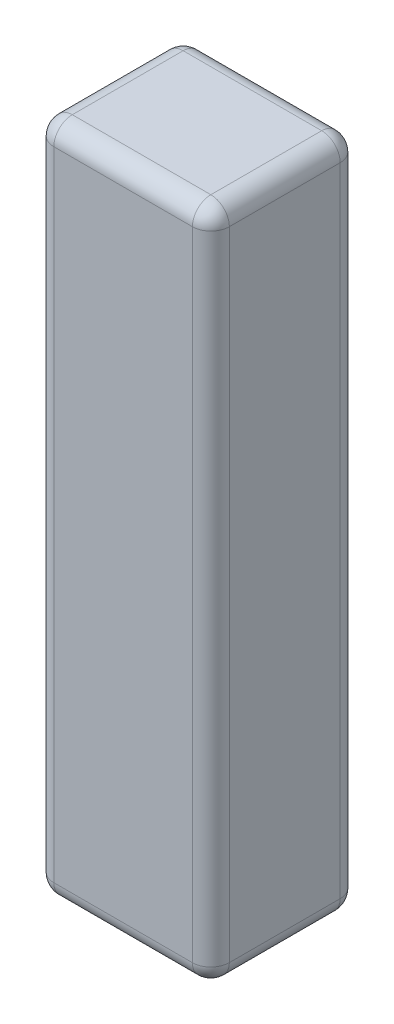
ISO-10303-21;
HEADER;
FILE_DESCRIPTION(('STEP AP214'),'2;1');
FILE_NAME('part.step','',(''),(''),'','','');
FILE_SCHEMA(('AUTOMOTIVE_DESIGN { 1 0 10303 214 1 1 1 1 }'));
ENDSEC;
DATA;
#1=APPLICATION_CONTEXT('core data for automotive mechanical design processes');
#2=APPLICATION_PROTOCOL_DEFINITION('international standard','automotive_design',2000,#1);
#3=PRODUCT_CONTEXT('',#1,'mechanical');
#4=PRODUCT('Part','Part','',(#3));
#5=PRODUCT_RELATED_PRODUCT_CATEGORY('part','',(#4));
#6=PRODUCT_DEFINITION_FORMATION('','',#4);
#7=PRODUCT_DEFINITION_CONTEXT('part definition',#1,'design');
#8=PRODUCT_DEFINITION('design','',#6,#7);
#9=PRODUCT_DEFINITION_SHAPE('','',#8);
#10=(LENGTH_UNIT() NAMED_UNIT(*) SI_UNIT(.MILLI.,.METRE.));
#11=(NAMED_UNIT(*) PLANE_ANGLE_UNIT() SI_UNIT($,.RADIAN.));
#12=(NAMED_UNIT(*) SI_UNIT($,.STERADIAN.) SOLID_ANGLE_UNIT());
#13=UNCERTAINTY_MEASURE_WITH_UNIT(LENGTH_MEASURE(1.E-05),#10,'distance_accuracy_value','');
#14=(GEOMETRIC_REPRESENTATION_CONTEXT(3) GLOBAL_UNCERTAINTY_ASSIGNED_CONTEXT((#13)) GLOBAL_UNIT_ASSIGNED_CONTEXT((#10,
#11,#12)) REPRESENTATION_CONTEXT('',''));
#15=CARTESIAN_POINT('',(0.,0.,0.));
#16=DIRECTION('',(0.,0.,1.));
#17=DIRECTION('',(1.,0.,0.));
#18=AXIS2_PLACEMENT_3D('',#15,#16,#17);
#19=CARTESIAN_POINT('',(9.5,73.,8.));
#20=DIRECTION('',(-1.,0.,0.));
#21=DIRECTION('',(0.,0.,1.));
#22=AXIS2_PLACEMENT_3D('',#19,#20,#21);
#23=PLANE('',#22);
#24=DIRECTION('',(0.,0.,-1.));
#25=VECTOR('',#24,1.);
#26=CARTESIAN_POINT('',(9.5,2.,-8.));
#27=LINE('',#26,#25);
#28=CARTESIAN_POINT('',(9.5,2.,6.));
#29=VERTEX_POINT('',#28);
#30=CARTESIAN_POINT('',(9.5,2.,-6.));
#31=VERTEX_POINT('',#30);
#32=EDGE_CURVE('E187',#29,#31,#27,.T.);
#33=ORIENTED_EDGE('',*,*,#32,.T.);
#34=DIRECTION('',(0.,-1.,0.));
#35=VECTOR('',#34,1.);
#36=CARTESIAN_POINT('',(9.5,73.,-6.));
#37=LINE('',#36,#35);
#38=CARTESIAN_POINT('',(9.5,71.,-6.));
#39=VERTEX_POINT('',#38);
#40=EDGE_CURVE('E192',#31,#39,#37,.F.);
#41=ORIENTED_EDGE('',*,*,#40,.T.);
#42=DIRECTION('',(0.,0.,-1.));
#43=VECTOR('',#42,1.);
#44=CARTESIAN_POINT('',(9.5,71.,8.));
#45=LINE('',#44,#43);
#46=CARTESIAN_POINT('',(9.5,71.,6.));
#47=VERTEX_POINT('',#46);
#48=EDGE_CURVE('E189',#39,#47,#45,.F.);
#49=ORIENTED_EDGE('',*,*,#48,.T.);
#50=DIRECTION('',(0.,-1.,0.));
#51=VECTOR('',#50,1.);
#52=CARTESIAN_POINT('',(9.5,73.,6.));
#53=LINE('',#52,#51);
#54=EDGE_CURVE('E185',#47,#29,#53,.T.);
#55=ORIENTED_EDGE('',*,*,#54,.T.);
#56=EDGE_LOOP('',(#33,#41,#49,#55));
#57=FACE_BOUND('',#56,.T.);
#58=ADVANCED_FACE('F38',(#57),#23,.F.);
#59=CARTESIAN_POINT('',(-9.5,73.,-8.));
#60=DIRECTION('',(0.,0.,1.));
#61=DIRECTION('',(1.,0.,0.));
#62=AXIS2_PLACEMENT_3D('',#59,#60,#61);
#63=PLANE('',#62);
#64=DIRECTION('',(-1.,0.,0.));
#65=VECTOR('',#64,1.);
#66=CARTESIAN_POINT('',(-9.5,2.,-8.));
#67=LINE('',#66,#65);
#68=CARTESIAN_POINT('',(7.5,2.,-8.));
#69=VERTEX_POINT('',#68);
#70=CARTESIAN_POINT('',(-7.5,2.,-8.));
#71=VERTEX_POINT('',#70);
#72=EDGE_CURVE('E178',#69,#71,#67,.T.);
#73=ORIENTED_EDGE('',*,*,#72,.T.);
#74=DIRECTION('',(0.,-1.,0.));
#75=VECTOR('',#74,1.);
#76=CARTESIAN_POINT('',(-7.5,73.,-8.));
#77=LINE('',#76,#75);
#78=CARTESIAN_POINT('',(-7.5,71.,-8.));
#79=VERTEX_POINT('',#78);
#80=EDGE_CURVE('E183',#71,#79,#77,.F.);
#81=ORIENTED_EDGE('',*,*,#80,.T.);
#82=DIRECTION('',(-1.,0.,0.));
#83=VECTOR('',#82,1.);
#84=CARTESIAN_POINT('',(-9.5,71.,-8.));
#85=LINE('',#84,#83);
#86=CARTESIAN_POINT('',(7.5,71.,-8.));
#87=VERTEX_POINT('',#86);
#88=EDGE_CURVE('E180',#79,#87,#85,.F.);
#89=ORIENTED_EDGE('',*,*,#88,.T.);
#90=DIRECTION('',(0.,-1.,0.));
#91=VECTOR('',#90,1.);
#92=CARTESIAN_POINT('',(7.5,73.,-8.));
#93=LINE('',#92,#91);
#94=EDGE_CURVE('E176',#87,#69,#93,.T.);
#95=ORIENTED_EDGE('',*,*,#94,.T.);
#96=EDGE_LOOP('',(#73,#81,#89,#95));
#97=FACE_BOUND('',#96,.T.);
#98=ADVANCED_FACE('F277',(#97),#63,.F.);
#99=CARTESIAN_POINT('',(-9.5,73.,8.));
#100=DIRECTION('',(1.,0.,0.));
#101=DIRECTION('',(0.,0.,-1.));
#102=AXIS2_PLACEMENT_3D('',#99,#100,#101);
#103=PLANE('',#102);
#104=DIRECTION('',(0.,0.,1.));
#105=VECTOR('',#104,1.);
#106=CARTESIAN_POINT('',(-9.5,2.,8.));
#107=LINE('',#106,#105);
#108=CARTESIAN_POINT('',(-9.5,2.,-6.));
#109=VERTEX_POINT('',#108);
#110=CARTESIAN_POINT('',(-9.5,2.,6.));
#111=VERTEX_POINT('',#110);
#112=EDGE_CURVE('E167',#109,#111,#107,.T.);
#113=ORIENTED_EDGE('',*,*,#112,.T.);
#114=DIRECTION('',(0.,-1.,0.));
#115=VECTOR('',#114,1.);
#116=CARTESIAN_POINT('',(-9.5,73.,6.));
#117=LINE('',#116,#115);
#118=CARTESIAN_POINT('',(-9.5,71.,6.));
#119=VERTEX_POINT('',#118);
#120=EDGE_CURVE('E174',#111,#119,#117,.F.);
#121=ORIENTED_EDGE('',*,*,#120,.T.);
#122=DIRECTION('',(0.,0.,1.));
#123=VECTOR('',#122,1.);
#124=CARTESIAN_POINT('',(-9.5,71.,8.));
#125=LINE('',#124,#123);
#126=CARTESIAN_POINT('',(-9.5,71.,-6.));
#127=VERTEX_POINT('',#126);
#128=EDGE_CURVE('E137',#119,#127,#125,.F.);
#129=ORIENTED_EDGE('',*,*,#128,.T.);
#130=DIRECTION('',(0.,-1.,0.));
#131=VECTOR('',#130,1.);
#132=CARTESIAN_POINT('',(-9.5,73.,-6.));
#133=LINE('',#132,#131);
#134=EDGE_CURVE('E165',#127,#109,#133,.T.);
#135=ORIENTED_EDGE('',*,*,#134,.T.);
#136=EDGE_LOOP('',(#113,#121,#129,#135));
#137=FACE_BOUND('',#136,.T.);
#138=ADVANCED_FACE('F335',(#137),#103,.F.);
#139=CARTESIAN_POINT('',(-9.5,73.,8.));
#140=DIRECTION('',(0.,0.,-1.));
#141=DIRECTION('',(-1.,0.,0.));
#142=AXIS2_PLACEMENT_3D('',#139,#140,#141);
#143=PLANE('',#142);
#144=DIRECTION('',(1.,0.,0.));
#145=VECTOR('',#144,1.);
#146=CARTESIAN_POINT('',(-9.5,71.,8.));
#147=LINE('',#146,#145);
#148=CARTESIAN_POINT('',(7.5,71.,8.));
#149=VERTEX_POINT('',#148);
#150=CARTESIAN_POINT('',(-7.5,71.,8.));
#151=VERTEX_POINT('',#150);
#152=EDGE_CURVE('E198',#149,#151,#147,.F.);
#153=ORIENTED_EDGE('',*,*,#152,.T.);
#154=DIRECTION('',(0.,-1.,0.));
#155=VECTOR('',#154,1.);
#156=CARTESIAN_POINT('',(-7.5,73.,8.));
#157=LINE('',#156,#155);
#158=CARTESIAN_POINT('',(-7.5,2.,8.));
#159=VERTEX_POINT('',#158);
#160=EDGE_CURVE('E201',#151,#159,#157,.T.);
#161=ORIENTED_EDGE('',*,*,#160,.T.);
#162=DIRECTION('',(1.,0.,0.));
#163=VECTOR('',#162,1.);
#164=CARTESIAN_POINT('',(9.5,2.,8.));
#165=LINE('',#164,#163);
#166=CARTESIAN_POINT('',(7.5,2.,8.));
#167=VERTEX_POINT('',#166);
#168=EDGE_CURVE('E196',#159,#167,#165,.T.);
#169=ORIENTED_EDGE('',*,*,#168,.T.);
#170=DIRECTION('',(0.,-1.,0.));
#171=VECTOR('',#170,1.);
#172=CARTESIAN_POINT('',(7.5,73.,8.));
#173=LINE('',#172,#171);
#174=EDGE_CURVE('E194',#167,#149,#173,.F.);
#175=ORIENTED_EDGE('',*,*,#174,.T.);
#176=EDGE_LOOP('',(#153,#161,#169,#175));
#177=FACE_BOUND('',#176,.T.);
#178=ADVANCED_FACE('F493',(#177),#143,.F.);
#179=CARTESIAN_POINT('',(0.,73.,0.));
#180=DIRECTION('',(0.,-1.,0.));
#181=DIRECTION('',(0.,0.,-1.));
#182=AXIS2_PLACEMENT_3D('',#179,#180,#181);
#183=PLANE('',#182);
#184=DIRECTION('',(-1.,0.,0.));
#185=VECTOR('',#184,1.);
#186=CARTESIAN_POINT('',(0.,73.,-6.));
#187=LINE('',#186,#185);
#188=CARTESIAN_POINT('',(7.5,73.,-6.));
#189=VERTEX_POINT('',#188);
#190=CARTESIAN_POINT('',(-7.5,73.,-6.));
#191=VERTEX_POINT('',#190);
#192=EDGE_CURVE('E163',#189,#191,#187,.T.);
#193=ORIENTED_EDGE('',*,*,#192,.T.);
#194=DIRECTION('',(0.,0.,1.));
#195=VECTOR('',#194,1.);
#196=CARTESIAN_POINT('',(-7.5,73.,0.));
#197=LINE('',#196,#195);
#198=CARTESIAN_POINT('',(-7.5,73.,6.));
#199=VERTEX_POINT('',#198);
#200=EDGE_CURVE('E135',#191,#199,#197,.T.);
#201=ORIENTED_EDGE('',*,*,#200,.T.);
#202=DIRECTION('',(1.,0.,0.));
#203=VECTOR('',#202,1.);
#204=CARTESIAN_POINT('',(0.,73.,6.));
#205=LINE('',#204,#203);
#206=CARTESIAN_POINT('',(7.5,73.,6.));
#207=VERTEX_POINT('',#206);
#208=EDGE_CURVE('E153',#199,#207,#205,.T.);
#209=ORIENTED_EDGE('',*,*,#208,.T.);
#210=DIRECTION('',(0.,0.,-1.));
#211=VECTOR('',#210,1.);
#212=CARTESIAN_POINT('',(7.5,73.,0.));
#213=LINE('',#212,#211);
#214=EDGE_CURVE('E159',#207,#189,#213,.T.);
#215=ORIENTED_EDGE('',*,*,#214,.T.);
#216=EDGE_LOOP('',(#193,#201,#209,#215));
#217=FACE_BOUND('',#216,.T.);
#218=ADVANCED_FACE('F161',(#217),#183,.F.);
#219=CARTESIAN_POINT('',(0.,0.,0.));
#220=DIRECTION('',(0.,-1.,0.));
#221=DIRECTION('',(0.,0.,-1.));
#222=AXIS2_PLACEMENT_3D('',#219,#220,#221);
#223=PLANE('',#222);
#224=DIRECTION('',(0.,0.,-1.));
#225=VECTOR('',#224,1.);
#226=CARTESIAN_POINT('',(7.5,0.,8.));
#227=LINE('',#226,#225);
#228=CARTESIAN_POINT('',(7.5,0.,-6.));
#229=VERTEX_POINT('',#228);
#230=CARTESIAN_POINT('',(7.5,0.,6.));
#231=VERTEX_POINT('',#230);
#232=EDGE_CURVE('E47',#229,#231,#227,.F.);
#233=ORIENTED_EDGE('',*,*,#232,.T.);
#234=DIRECTION('',(1.,0.,0.));
#235=VECTOR('',#234,1.);
#236=CARTESIAN_POINT('',(-9.5,0.,6.));
#237=LINE('',#236,#235);
#238=CARTESIAN_POINT('',(-7.5,0.,6.));
#239=VERTEX_POINT('',#238);
#240=EDGE_CURVE('E11',#231,#239,#237,.F.);
#241=ORIENTED_EDGE('',*,*,#240,.T.);
#242=DIRECTION('',(0.,0.,1.));
#243=VECTOR('',#242,1.);
#244=CARTESIAN_POINT('',(-7.5,0.,-8.));
#245=LINE('',#244,#243);
#246=CARTESIAN_POINT('',(-7.5,0.,-6.));
#247=VERTEX_POINT('',#246);
#248=EDGE_CURVE('E205',#239,#247,#245,.F.);
#249=ORIENTED_EDGE('',*,*,#248,.T.);
#250=DIRECTION('',(-1.,0.,0.));
#251=VECTOR('',#250,1.);
#252=CARTESIAN_POINT('',(9.5,0.,-6.));
#253=LINE('',#252,#251);
#254=EDGE_CURVE('E203',#247,#229,#253,.F.);
#255=ORIENTED_EDGE('',*,*,#254,.T.);
#256=EDGE_LOOP('',(#233,#241,#249,#255));
#257=FACE_BOUND('',#256,.T.);
#258=ADVANCED_FACE('F303',(#257),#223,.T.);
#259=CARTESIAN_POINT('',(7.5,2.,8.));
#260=DIRECTION('',(0.,0.,1.));
#261=DIRECTION('',(1.,0.,0.));
#262=AXIS2_PLACEMENT_3D('',#259,#260,#261);
#263=CYLINDRICAL_SURFACE('',#262,2.);
#264=CARTESIAN_POINT('',(7.5,2.,-6.));
#265=DIRECTION('',(0.,0.,-1.));
#266=DIRECTION('',(-1.,0.,0.));
#267=AXIS2_PLACEMENT_3D('',#264,#265,#266);
#268=CIRCLE('',#267,2.);
#269=EDGE_CURVE('E42',#31,#229,#268,.T.);
#270=ORIENTED_EDGE('',*,*,#269,.F.);
#271=ORIENTED_EDGE('',*,*,#32,.F.);
#272=CARTESIAN_POINT('',(7.5,2.,6.));
#273=DIRECTION('',(0.,0.,1.));
#274=DIRECTION('',(1.,0.,0.));
#275=AXIS2_PLACEMENT_3D('',#272,#273,#274);
#276=CIRCLE('',#275,2.);
#277=EDGE_CURVE('E255',#231,#29,#276,.T.);
#278=ORIENTED_EDGE('',*,*,#277,.F.);
#279=ORIENTED_EDGE('',*,*,#232,.F.);
#280=EDGE_LOOP('',(#270,#271,#278,#279));
#281=FACE_BOUND('',#280,.T.);
#282=ADVANCED_FACE('F40',(#281),#263,.T.);
#283=CARTESIAN_POINT('',(7.5,2.,-6.));
#284=DIRECTION('',(0.,0.,1.));
#285=DIRECTION('',(1.,0.,0.));
#286=AXIS2_PLACEMENT_3D('',#283,#284,#285);
#287=SPHERICAL_SURFACE('',#286,2.);
#288=CARTESIAN_POINT('',(7.5,2.,-6.));
#289=DIRECTION('',(0.,-1.,0.));
#290=DIRECTION('',(0.,0.,-1.));
#291=AXIS2_PLACEMENT_3D('',#288,#289,#290);
#292=CIRCLE('',#291,2.);
#293=EDGE_CURVE('E250',#31,#69,#292,.F.);
#294=ORIENTED_EDGE('',*,*,#293,.F.);
#295=ORIENTED_EDGE('',*,*,#269,.T.);
#296=CARTESIAN_POINT('',(7.5,2.,-6.));
#297=DIRECTION('',(1.,0.,0.));
#298=DIRECTION('',(0.,0.,-1.));
#299=AXIS2_PLACEMENT_3D('',#296,#297,#298);
#300=CIRCLE('',#299,2.);
#301=EDGE_CURVE('E253',#69,#229,#300,.F.);
#302=ORIENTED_EDGE('',*,*,#301,.F.);
#303=EDGE_LOOP('',(#294,#295,#302));
#304=FACE_BOUND('',#303,.T.);
#305=ADVANCED_FACE('F265',(#304),#287,.T.);
#306=CARTESIAN_POINT('',(7.5,2.,6.));
#307=DIRECTION('',(0.,0.,1.));
#308=DIRECTION('',(1.,0.,0.));
#309=AXIS2_PLACEMENT_3D('',#306,#307,#308);
#310=SPHERICAL_SURFACE('',#309,2.);
#311=CARTESIAN_POINT('',(7.5,2.,6.));
#312=DIRECTION('',(1.,0.,0.));
#313=DIRECTION('',(0.,0.,-1.));
#314=AXIS2_PLACEMENT_3D('',#311,#312,#313);
#315=CIRCLE('',#314,2.);
#316=EDGE_CURVE('E244',#231,#167,#315,.F.);
#317=ORIENTED_EDGE('',*,*,#316,.F.);
#318=ORIENTED_EDGE('',*,*,#277,.T.);
#319=CARTESIAN_POINT('',(7.5,2.,6.));
#320=DIRECTION('',(0.,-1.,0.));
#321=DIRECTION('',(0.,0.,-1.));
#322=AXIS2_PLACEMENT_3D('',#319,#320,#321);
#323=CIRCLE('',#322,2.);
#324=EDGE_CURVE('E247',#167,#29,#323,.F.);
#325=ORIENTED_EDGE('',*,*,#324,.F.);
#326=EDGE_LOOP('',(#317,#318,#325));
#327=FACE_BOUND('',#326,.T.);
#328=ADVANCED_FACE('F298',(#327),#310,.T.);
#329=CARTESIAN_POINT('',(-9.5,2.,-6.));
#330=DIRECTION('',(1.,0.,0.));
#331=DIRECTION('',(0.,0.,-1.));
#332=AXIS2_PLACEMENT_3D('',#329,#330,#331);
#333=CYLINDRICAL_SURFACE('',#332,2.);
#334=ORIENTED_EDGE('',*,*,#301,.T.);
#335=ORIENTED_EDGE('',*,*,#254,.F.);
#336=CARTESIAN_POINT('',(-7.5,2.,-6.));
#337=DIRECTION('',(-1.,0.,0.));
#338=DIRECTION('',(0.,0.,1.));
#339=AXIS2_PLACEMENT_3D('',#336,#337,#338);
#340=CIRCLE('',#339,2.);
#341=EDGE_CURVE('E238',#71,#247,#340,.T.);
#342=ORIENTED_EDGE('',*,*,#341,.F.);
#343=ORIENTED_EDGE('',*,*,#72,.F.);
#344=EDGE_LOOP('',(#334,#335,#342,#343));
#345=FACE_BOUND('',#344,.T.);
#346=ADVANCED_FACE('F272',(#345),#333,.T.);
#347=CARTESIAN_POINT('',(7.5,73.,-6.));
#348=DIRECTION('',(0.,-1.,0.));
#349=DIRECTION('',(0.,0.,-1.));
#350=AXIS2_PLACEMENT_3D('',#347,#348,#349);
#351=CYLINDRICAL_SURFACE('',#350,2.);
#352=ORIENTED_EDGE('',*,*,#293,.T.);
#353=ORIENTED_EDGE('',*,*,#94,.F.);
#354=CARTESIAN_POINT('',(7.5,71.,-6.));
#355=DIRECTION('',(0.,1.,0.));
#356=DIRECTION('',(0.,0.,1.));
#357=AXIS2_PLACEMENT_3D('',#354,#355,#356);
#358=CIRCLE('',#357,2.);
#359=EDGE_CURVE('E235',#39,#87,#358,.T.);
#360=ORIENTED_EDGE('',*,*,#359,.F.);
#361=ORIENTED_EDGE('',*,*,#40,.F.);
#362=EDGE_LOOP('',(#352,#353,#360,#361));
#363=FACE_BOUND('',#362,.T.);
#364=ADVANCED_FACE('F283',(#363),#351,.T.);
#365=CARTESIAN_POINT('',(7.5,71.,0.));
#366=DIRECTION('',(0.,0.,-1.));
#367=DIRECTION('',(-1.,0.,0.));
#368=AXIS2_PLACEMENT_3D('',#365,#366,#367);
#369=CYLINDRICAL_SURFACE('',#368,2.);
#370=CARTESIAN_POINT('',(7.5,71.,6.));
#371=DIRECTION('',(0.,0.,1.));
#372=DIRECTION('',(1.,0.,0.));
#373=AXIS2_PLACEMENT_3D('',#370,#371,#372);
#374=CIRCLE('',#373,2.);
#375=EDGE_CURVE('E229',#47,#207,#374,.T.);
#376=ORIENTED_EDGE('',*,*,#375,.F.);
#377=ORIENTED_EDGE('',*,*,#48,.F.);
#378=CARTESIAN_POINT('',(7.5,71.,-6.));
#379=DIRECTION('',(0.,0.,-1.));
#380=DIRECTION('',(-1.,0.,0.));
#381=AXIS2_PLACEMENT_3D('',#378,#379,#380);
#382=CIRCLE('',#381,2.);
#383=EDGE_CURVE('E232',#189,#39,#382,.T.);
#384=ORIENTED_EDGE('',*,*,#383,.F.);
#385=ORIENTED_EDGE('',*,*,#214,.F.);
#386=EDGE_LOOP('',(#376,#377,#384,#385));
#387=FACE_BOUND('',#386,.T.);
#388=ADVANCED_FACE('F289',(#387),#369,.T.);
#389=CARTESIAN_POINT('',(7.5,73.,6.));
#390=DIRECTION('',(0.,-1.,0.));
#391=DIRECTION('',(0.,0.,-1.));
#392=AXIS2_PLACEMENT_3D('',#389,#390,#391);
#393=CYLINDRICAL_SURFACE('',#392,2.);
#394=ORIENTED_EDGE('',*,*,#324,.T.);
#395=ORIENTED_EDGE('',*,*,#54,.F.);
#396=CARTESIAN_POINT('',(7.5,71.,6.));
#397=DIRECTION('',(0.,1.,0.));
#398=DIRECTION('',(0.,0.,1.));
#399=AXIS2_PLACEMENT_3D('',#396,#397,#398);
#400=CIRCLE('',#399,2.);
#401=EDGE_CURVE('E227',#149,#47,#400,.T.);
#402=ORIENTED_EDGE('',*,*,#401,.F.);
#403=ORIENTED_EDGE('',*,*,#174,.F.);
#404=EDGE_LOOP('',(#394,#395,#402,#403));
#405=FACE_BOUND('',#404,.T.);
#406=ADVANCED_FACE('F295',(#405),#393,.T.);
#407=CARTESIAN_POINT('',(-9.5,2.,6.));
#408=DIRECTION('',(-1.,0.,0.));
#409=DIRECTION('',(0.,0.,1.));
#410=AXIS2_PLACEMENT_3D('',#407,#408,#409);
#411=CYLINDRICAL_SURFACE('',#410,2.);
#412=ORIENTED_EDGE('',*,*,#316,.T.);
#413=ORIENTED_EDGE('',*,*,#168,.F.);
#414=CARTESIAN_POINT('',(-7.5,2.,6.));
#415=DIRECTION('',(-1.,0.,0.));
#416=DIRECTION('',(0.,0.,1.));
#417=AXIS2_PLACEMENT_3D('',#414,#415,#416);
#418=CIRCLE('',#417,2.);
#419=EDGE_CURVE('E225',#239,#159,#418,.T.);
#420=ORIENTED_EDGE('',*,*,#419,.F.);
#421=ORIENTED_EDGE('',*,*,#240,.F.);
#422=EDGE_LOOP('',(#412,#413,#420,#421));
#423=FACE_BOUND('',#422,.T.);
#424=ADVANCED_FACE('F301',(#423),#411,.T.);
#425=CARTESIAN_POINT('',(-7.5,2.,8.));
#426=DIRECTION('',(0.,0.,-1.));
#427=DIRECTION('',(-1.,0.,0.));
#428=AXIS2_PLACEMENT_3D('',#425,#426,#427);
#429=CYLINDRICAL_SURFACE('',#428,2.);
#430=CARTESIAN_POINT('',(-7.5,2.,-6.));
#431=DIRECTION('',(0.,0.,-1.));
#432=DIRECTION('',(-1.,0.,0.));
#433=AXIS2_PLACEMENT_3D('',#430,#431,#432);
#434=CIRCLE('',#433,2.);
#435=EDGE_CURVE('E241',#247,#109,#434,.T.);
#436=ORIENTED_EDGE('',*,*,#435,.F.);
#437=ORIENTED_EDGE('',*,*,#248,.F.);
#438=CARTESIAN_POINT('',(-7.5,2.,6.));
#439=DIRECTION('',(0.,0.,1.));
#440=DIRECTION('',(1.,0.,0.));
#441=AXIS2_PLACEMENT_3D('',#438,#439,#440);
#442=CIRCLE('',#441,2.);
#443=EDGE_CURVE('E61',#111,#239,#442,.T.);
#444=ORIENTED_EDGE('',*,*,#443,.F.);
#445=ORIENTED_EDGE('',*,*,#112,.F.);
#446=EDGE_LOOP('',(#436,#437,#444,#445));
#447=FACE_BOUND('',#446,.T.);
#448=ADVANCED_FACE('F305',(#447),#429,.T.);
#449=CARTESIAN_POINT('',(-7.5,2.,-6.));
#450=DIRECTION('',(0.,0.,1.));
#451=DIRECTION('',(1.,0.,0.));
#452=AXIS2_PLACEMENT_3D('',#449,#450,#451);
#453=SPHERICAL_SURFACE('',#452,2.);
#454=ORIENTED_EDGE('',*,*,#341,.T.);
#455=ORIENTED_EDGE('',*,*,#435,.T.);
#456=CARTESIAN_POINT('',(-7.5,2.,-6.));
#457=DIRECTION('',(0.,-1.,0.));
#458=DIRECTION('',(0.,0.,-1.));
#459=AXIS2_PLACEMENT_3D('',#456,#457,#458);
#460=CIRCLE('',#459,2.);
#461=EDGE_CURVE('E221',#71,#109,#460,.F.);
#462=ORIENTED_EDGE('',*,*,#461,.F.);
#463=EDGE_LOOP('',(#454,#455,#462));
#464=FACE_BOUND('',#463,.T.);
#465=ADVANCED_FACE('F308',(#464),#453,.T.);
#466=CARTESIAN_POINT('',(7.5,71.,-6.));
#467=DIRECTION('',(0.,0.,1.));
#468=DIRECTION('',(1.,0.,0.));
#469=AXIS2_PLACEMENT_3D('',#466,#467,#468);
#470=SPHERICAL_SURFACE('',#469,2.);
#471=ORIENTED_EDGE('',*,*,#383,.T.);
#472=ORIENTED_EDGE('',*,*,#359,.T.);
#473=CARTESIAN_POINT('',(7.5,71.,-6.));
#474=DIRECTION('',(1.,0.,0.));
#475=DIRECTION('',(0.,1.,0.));
#476=AXIS2_PLACEMENT_3D('',#473,#474,#475);
#477=CIRCLE('',#476,2.);
#478=EDGE_CURVE('E219',#189,#87,#477,.F.);
#479=ORIENTED_EDGE('',*,*,#478,.F.);
#480=EDGE_LOOP('',(#471,#472,#479));
#481=FACE_BOUND('',#480,.T.);
#482=ADVANCED_FACE('F319',(#481),#470,.T.);
#483=CARTESIAN_POINT('',(7.5,71.,6.));
#484=DIRECTION('',(0.,0.,1.));
#485=DIRECTION('',(1.,0.,0.));
#486=AXIS2_PLACEMENT_3D('',#483,#484,#485);
#487=SPHERICAL_SURFACE('',#486,2.);
#488=ORIENTED_EDGE('',*,*,#401,.T.);
#489=ORIENTED_EDGE('',*,*,#375,.T.);
#490=CARTESIAN_POINT('',(7.5,71.,6.));
#491=DIRECTION('',(1.,0.,0.));
#492=DIRECTION('',(0.,0.,-1.));
#493=AXIS2_PLACEMENT_3D('',#490,#491,#492);
#494=CIRCLE('',#493,2.);
#495=EDGE_CURVE('E156',#149,#207,#494,.F.);
#496=ORIENTED_EDGE('',*,*,#495,.F.);
#497=EDGE_LOOP('',(#488,#489,#496));
#498=FACE_BOUND('',#497,.T.);
#499=ADVANCED_FACE('F321',(#498),#487,.T.);
#500=CARTESIAN_POINT('',(-7.5,2.,6.));
#501=DIRECTION('',(0.,0.,1.));
#502=DIRECTION('',(1.,0.,0.));
#503=AXIS2_PLACEMENT_3D('',#500,#501,#502);
#504=SPHERICAL_SURFACE('',#503,2.);
#505=ORIENTED_EDGE('',*,*,#443,.T.);
#506=ORIENTED_EDGE('',*,*,#419,.T.);
#507=CARTESIAN_POINT('',(-7.5,2.,6.));
#508=DIRECTION('',(0.,-1.,0.));
#509=DIRECTION('',(0.,0.,-1.));
#510=AXIS2_PLACEMENT_3D('',#507,#508,#509);
#511=CIRCLE('',#510,2.);
#512=EDGE_CURVE('E215',#111,#159,#511,.F.);
#513=ORIENTED_EDGE('',*,*,#512,.F.);
#514=EDGE_LOOP('',(#505,#506,#513));
#515=FACE_BOUND('',#514,.T.);
#516=ADVANCED_FACE('F327',(#515),#504,.T.);
#517=CARTESIAN_POINT('',(-7.5,73.,-6.));
#518=DIRECTION('',(0.,-1.,0.));
#519=DIRECTION('',(0.,0.,-1.));
#520=AXIS2_PLACEMENT_3D('',#517,#518,#519);
#521=CYLINDRICAL_SURFACE('',#520,2.);
#522=ORIENTED_EDGE('',*,*,#461,.T.);
#523=ORIENTED_EDGE('',*,*,#134,.F.);
#524=CARTESIAN_POINT('',(-7.5,71.,-6.));
#525=DIRECTION('',(0.,1.,0.));
#526=DIRECTION('',(0.,0.,1.));
#527=AXIS2_PLACEMENT_3D('',#524,#525,#526);
#528=CIRCLE('',#527,2.);
#529=EDGE_CURVE('E212',#79,#127,#528,.T.);
#530=ORIENTED_EDGE('',*,*,#529,.F.);
#531=ORIENTED_EDGE('',*,*,#80,.F.);
#532=EDGE_LOOP('',(#522,#523,#530,#531));
#533=FACE_BOUND('',#532,.T.);
#534=ADVANCED_FACE('F312',(#533),#521,.T.);
#535=CARTESIAN_POINT('',(0.,71.,-6.));
#536=DIRECTION('',(-1.,0.,0.));
#537=DIRECTION('',(0.,0.,1.));
#538=AXIS2_PLACEMENT_3D('',#535,#536,#537);
#539=CYLINDRICAL_SURFACE('',#538,2.);
#540=ORIENTED_EDGE('',*,*,#478,.T.);
#541=ORIENTED_EDGE('',*,*,#88,.F.);
#542=CARTESIAN_POINT('',(-7.5,71.,-6.));
#543=DIRECTION('',(-1.,0.,0.));
#544=DIRECTION('',(0.,0.,1.));
#545=AXIS2_PLACEMENT_3D('',#542,#543,#544);
#546=CIRCLE('',#545,2.);
#547=EDGE_CURVE('E150',#191,#79,#546,.T.);
#548=ORIENTED_EDGE('',*,*,#547,.F.);
#549=ORIENTED_EDGE('',*,*,#192,.F.);
#550=EDGE_LOOP('',(#540,#541,#548,#549));
#551=FACE_BOUND('',#550,.T.);
#552=ADVANCED_FACE('F317',(#551),#539,.T.);
#553=CARTESIAN_POINT('',(0.,71.,6.));
#554=DIRECTION('',(1.,0.,0.));
#555=DIRECTION('',(0.,0.,-1.));
#556=AXIS2_PLACEMENT_3D('',#553,#554,#555);
#557=CYLINDRICAL_SURFACE('',#556,2.);
#558=ORIENTED_EDGE('',*,*,#495,.T.);
#559=ORIENTED_EDGE('',*,*,#208,.F.);
#560=CARTESIAN_POINT('',(-7.5,71.,6.));
#561=DIRECTION('',(-1.,0.,0.));
#562=DIRECTION('',(0.,0.,1.));
#563=AXIS2_PLACEMENT_3D('',#560,#561,#562);
#564=CIRCLE('',#563,2.);
#565=EDGE_CURVE('E142',#151,#199,#564,.T.);
#566=ORIENTED_EDGE('',*,*,#565,.F.);
#567=ORIENTED_EDGE('',*,*,#152,.F.);
#568=EDGE_LOOP('',(#558,#559,#566,#567));
#569=FACE_BOUND('',#568,.T.);
#570=ADVANCED_FACE('F154',(#569),#557,.T.);
#571=CARTESIAN_POINT('',(-7.5,73.,6.));
#572=DIRECTION('',(0.,-1.,0.));
#573=DIRECTION('',(0.,0.,-1.));
#574=AXIS2_PLACEMENT_3D('',#571,#572,#573);
#575=CYLINDRICAL_SURFACE('',#574,2.);
#576=ORIENTED_EDGE('',*,*,#512,.T.);
#577=ORIENTED_EDGE('',*,*,#160,.F.);
#578=CARTESIAN_POINT('',(-7.5,71.,6.));
#579=DIRECTION('',(0.,1.,0.));
#580=DIRECTION('',(0.,0.,1.));
#581=AXIS2_PLACEMENT_3D('',#578,#579,#580);
#582=CIRCLE('',#581,2.);
#583=EDGE_CURVE('E146',#119,#151,#582,.T.);
#584=ORIENTED_EDGE('',*,*,#583,.F.);
#585=ORIENTED_EDGE('',*,*,#120,.F.);
#586=EDGE_LOOP('',(#576,#577,#584,#585));
#587=FACE_BOUND('',#586,.T.);
#588=ADVANCED_FACE('F345',(#587),#575,.T.);
#589=CARTESIAN_POINT('',(-7.5,71.,-6.));
#590=DIRECTION('',(0.,0.,1.));
#591=DIRECTION('',(1.,0.,0.));
#592=AXIS2_PLACEMENT_3D('',#589,#590,#591);
#593=SPHERICAL_SURFACE('',#592,2.);
#594=ORIENTED_EDGE('',*,*,#547,.T.);
#595=ORIENTED_EDGE('',*,*,#529,.T.);
#596=CARTESIAN_POINT('',(-7.5,71.,-6.));
#597=DIRECTION('',(0.,0.,-1.));
#598=DIRECTION('',(-1.,0.,0.));
#599=AXIS2_PLACEMENT_3D('',#596,#597,#598);
#600=CIRCLE('',#599,2.);
#601=EDGE_CURVE('E139',#191,#127,#600,.F.);
#602=ORIENTED_EDGE('',*,*,#601,.F.);
#603=EDGE_LOOP('',(#594,#595,#602));
#604=FACE_BOUND('',#603,.T.);
#605=ADVANCED_FACE('F315',(#604),#593,.T.);
#606=CARTESIAN_POINT('',(-7.5,71.,6.));
#607=DIRECTION('',(0.,0.,1.));
#608=DIRECTION('',(1.,0.,0.));
#609=AXIS2_PLACEMENT_3D('',#606,#607,#608);
#610=SPHERICAL_SURFACE('',#609,2.);
#611=ORIENTED_EDGE('',*,*,#583,.T.);
#612=ORIENTED_EDGE('',*,*,#565,.T.);
#613=CARTESIAN_POINT('',(-7.5,71.,6.));
#614=DIRECTION('',(0.,0.,1.));
#615=DIRECTION('',(1.,0.,0.));
#616=AXIS2_PLACEMENT_3D('',#613,#614,#615);
#617=CIRCLE('',#616,2.);
#618=EDGE_CURVE('E131',#119,#199,#617,.F.);
#619=ORIENTED_EDGE('',*,*,#618,.F.);
#620=EDGE_LOOP('',(#611,#612,#619));
#621=FACE_BOUND('',#620,.T.);
#622=ADVANCED_FACE('F144',(#621),#610,.T.);
#623=CARTESIAN_POINT('',(-7.5,71.,0.));
#624=DIRECTION('',(0.,0.,1.));
#625=DIRECTION('',(1.,0.,0.));
#626=AXIS2_PLACEMENT_3D('',#623,#624,#625);
#627=CYLINDRICAL_SURFACE('',#626,2.);
#628=ORIENTED_EDGE('',*,*,#601,.T.);
#629=ORIENTED_EDGE('',*,*,#128,.F.);
#630=ORIENTED_EDGE('',*,*,#618,.T.);
#631=ORIENTED_EDGE('',*,*,#200,.F.);
#632=EDGE_LOOP('',(#628,#629,#630,#631));
#633=FACE_BOUND('',#632,.T.);
#634=ADVANCED_FACE('F133',(#633),#627,.T.);
#635=CLOSED_SHELL('',(#58,#98,#138,#178,#218,#258,#282,#305,#328,#346,#364,#388,#406,#424,#448,
#465,#482,#499,#516,#534,#552,#570,#588,#605,#622,#634));
#636=MANIFOLD_SOLID_BREP('B2',#635);
#637=ADVANCED_BREP_SHAPE_REPRESENTATION('',(#18,#636),#14);
#638=SHAPE_DEFINITION_REPRESENTATION(#9,#637);
ENDSEC;
END-ISO-10303-21;
